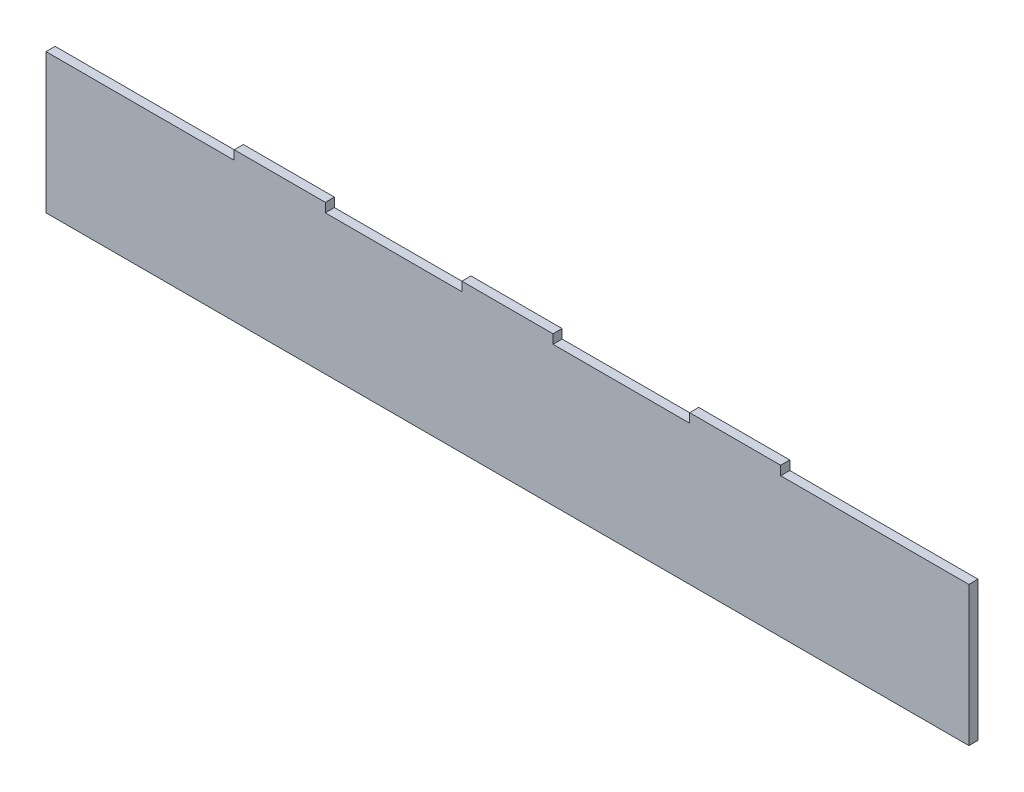
ISO-10303-21;
HEADER;
FILE_DESCRIPTION(('STEP AP214'),'2;1');
FILE_NAME('part.step','',(''),(''),'','','');
FILE_SCHEMA(('AUTOMOTIVE_DESIGN { 1 0 10303 214 1 1 1 1 }'));
ENDSEC;
DATA;
#1=APPLICATION_CONTEXT('core data for automotive mechanical design processes');
#2=APPLICATION_PROTOCOL_DEFINITION('international standard','automotive_design',2000,#1);
#3=PRODUCT_CONTEXT('',#1,'mechanical');
#4=PRODUCT('Part','Part','',(#3));
#5=PRODUCT_RELATED_PRODUCT_CATEGORY('part','',(#4));
#6=PRODUCT_DEFINITION_FORMATION('','',#4);
#7=PRODUCT_DEFINITION_CONTEXT('part definition',#1,'design');
#8=PRODUCT_DEFINITION('design','',#6,#7);
#9=PRODUCT_DEFINITION_SHAPE('','',#8);
#10=(LENGTH_UNIT() NAMED_UNIT(*) SI_UNIT(.MILLI.,.METRE.));
#11=(NAMED_UNIT(*) PLANE_ANGLE_UNIT() SI_UNIT($,.RADIAN.));
#12=(NAMED_UNIT(*) SI_UNIT($,.STERADIAN.) SOLID_ANGLE_UNIT());
#13=UNCERTAINTY_MEASURE_WITH_UNIT(LENGTH_MEASURE(1.E-05),#10,'distance_accuracy_value','');
#14=(GEOMETRIC_REPRESENTATION_CONTEXT(3) GLOBAL_UNCERTAINTY_ASSIGNED_CONTEXT((#13)) GLOBAL_UNIT_ASSIGNED_CONTEXT((#10,
#11,#12)) REPRESENTATION_CONTEXT('',''));
#15=CARTESIAN_POINT('',(0.,0.,0.));
#16=DIRECTION('',(0.,0.,1.));
#17=DIRECTION('',(1.,0.,0.));
#18=AXIS2_PLACEMENT_3D('',#15,#16,#17);
#19=CARTESIAN_POINT('',(-15.,0.,3.));
#20=DIRECTION('',(-1.,0.,0.));
#21=DIRECTION('',(0.,-1.,0.));
#22=AXIS2_PLACEMENT_3D('',#19,#20,#21);
#23=PLANE('',#22);
#24=DIRECTION('',(0.,1.,0.));
#25=VECTOR('',#24,1.);
#26=CARTESIAN_POINT('',(-15.,0.,0.));
#27=LINE('',#26,#25);
#28=CARTESIAN_POINT('',(-15.,23.0000000000001,0.));
#29=VERTEX_POINT('',#28);
#30=CARTESIAN_POINT('',(-15.,26.0000000000001,0.));
#31=VERTEX_POINT('',#30);
#32=EDGE_CURVE('E175',#29,#31,#27,.T.);
#33=ORIENTED_EDGE('',*,*,#32,.F.);
#34=DIRECTION('',(0.,0.,-1.));
#35=VECTOR('',#34,1.);
#36=CARTESIAN_POINT('',(-15.,23.0000000000001,3.));
#37=LINE('',#36,#35);
#38=CARTESIAN_POINT('',(-15.,23.0000000000001,3.));
#39=VERTEX_POINT('',#38);
#40=EDGE_CURVE('E11',#39,#29,#37,.T.);
#41=ORIENTED_EDGE('',*,*,#40,.F.);
#42=DIRECTION('',(0.,1.,0.));
#43=VECTOR('',#42,1.);
#44=CARTESIAN_POINT('',(-15.,0.,3.));
#45=LINE('',#44,#43);
#46=CARTESIAN_POINT('',(-15.,26.0000000000001,3.));
#47=VERTEX_POINT('',#46);
#48=EDGE_CURVE('E213',#39,#47,#45,.T.);
#49=ORIENTED_EDGE('',*,*,#48,.T.);
#50=DIRECTION('',(0.,0.,-1.));
#51=VECTOR('',#50,1.);
#52=CARTESIAN_POINT('',(-15.,26.0000000000001,3.));
#53=LINE('',#52,#51);
#54=EDGE_CURVE('E110',#47,#31,#53,.T.);
#55=ORIENTED_EDGE('',*,*,#54,.T.);
#56=EDGE_LOOP('',(#33,#41,#49,#55));
#57=FACE_BOUND('',#56,.T.);
#58=ADVANCED_FACE('F35',(#57),#23,.T.);
#59=CARTESIAN_POINT('',(0.,23.0000000000001,3.));
#60=DIRECTION('',(0.,-1.,0.));
#61=DIRECTION('',(1.,0.,0.));
#62=AXIS2_PLACEMENT_3D('',#59,#60,#61);
#63=PLANE('',#62);
#64=DIRECTION('',(-1.,0.,0.));
#65=VECTOR('',#64,1.);
#66=CARTESIAN_POINT('',(0.,23.0000000000001,0.));
#67=LINE('',#66,#65);
#68=CARTESIAN_POINT('',(-60.,23.0000000000001,0.));
#69=VERTEX_POINT('',#68);
#70=EDGE_CURVE('E178',#29,#69,#67,.T.);
#71=ORIENTED_EDGE('',*,*,#70,.T.);
#72=DIRECTION('',(0.,0.,-1.));
#73=VECTOR('',#72,1.);
#74=CARTESIAN_POINT('',(-60.,23.0000000000001,3.));
#75=LINE('',#74,#73);
#76=CARTESIAN_POINT('',(-60.,23.0000000000001,3.));
#77=VERTEX_POINT('',#76);
#78=EDGE_CURVE('E43',#77,#69,#75,.T.);
#79=ORIENTED_EDGE('',*,*,#78,.F.);
#80=DIRECTION('',(-1.,0.,0.));
#81=VECTOR('',#80,1.);
#82=CARTESIAN_POINT('',(0.,23.0000000000001,3.));
#83=LINE('',#82,#81);
#84=EDGE_CURVE('E266',#39,#77,#83,.T.);
#85=ORIENTED_EDGE('',*,*,#84,.F.);
#86=ORIENTED_EDGE('',*,*,#40,.T.);
#87=EDGE_LOOP('',(#71,#79,#85,#86));
#88=FACE_BOUND('',#87,.T.);
#89=ADVANCED_FACE('F293',(#88),#63,.F.);
#90=CARTESIAN_POINT('',(-60.,0.,3.));
#91=DIRECTION('',(-1.,0.,0.));
#92=DIRECTION('',(0.,0.,1.));
#93=AXIS2_PLACEMENT_3D('',#90,#91,#92);
#94=PLANE('',#93);
#95=DIRECTION('',(0.,1.,0.));
#96=VECTOR('',#95,1.);
#97=CARTESIAN_POINT('',(-60.,0.,0.));
#98=LINE('',#97,#96);
#99=CARTESIAN_POINT('',(-60.,26.0000000000001,0.));
#100=VERTEX_POINT('',#99);
#101=EDGE_CURVE('E180',#69,#100,#98,.T.);
#102=ORIENTED_EDGE('',*,*,#101,.T.);
#103=DIRECTION('',(0.,0.,-1.));
#104=VECTOR('',#103,1.);
#105=CARTESIAN_POINT('',(-60.,26.0000000000001,3.));
#106=LINE('',#105,#104);
#107=CARTESIAN_POINT('',(-60.,26.0000000000001,3.));
#108=VERTEX_POINT('',#107);
#109=EDGE_CURVE('E238',#108,#100,#106,.T.);
#110=ORIENTED_EDGE('',*,*,#109,.F.);
#111=DIRECTION('',(0.,1.,0.));
#112=VECTOR('',#111,1.);
#113=CARTESIAN_POINT('',(-60.,0.,3.));
#114=LINE('',#113,#112);
#115=EDGE_CURVE('E247',#77,#108,#114,.T.);
#116=ORIENTED_EDGE('',*,*,#115,.F.);
#117=ORIENTED_EDGE('',*,*,#78,.T.);
#118=EDGE_LOOP('',(#102,#110,#116,#117));
#119=FACE_BOUND('',#118,.T.);
#120=ADVANCED_FACE('F245',(#119),#94,.F.);
#121=CARTESIAN_POINT('',(0.,26.0000000000001,3.));
#122=DIRECTION('',(0.,-1.,0.));
#123=DIRECTION('',(1.,0.,0.));
#124=AXIS2_PLACEMENT_3D('',#121,#122,#123);
#125=PLANE('',#124);
#126=DIRECTION('',(-1.,0.,0.));
#127=VECTOR('',#126,1.);
#128=CARTESIAN_POINT('',(0.,26.0000000000001,0.));
#129=LINE('',#128,#127);
#130=CARTESIAN_POINT('',(-90.,26.,0.));
#131=VERTEX_POINT('',#130);
#132=EDGE_CURVE('E182',#100,#131,#129,.T.);
#133=ORIENTED_EDGE('',*,*,#132,.T.);
#134=DIRECTION('',(0.,0.,-1.));
#135=VECTOR('',#134,1.);
#136=CARTESIAN_POINT('',(-90.,26.,3.));
#137=LINE('',#136,#135);
#138=CARTESIAN_POINT('',(-90.,26.,3.));
#139=VERTEX_POINT('',#138);
#140=EDGE_CURVE('E236',#139,#131,#137,.T.);
#141=ORIENTED_EDGE('',*,*,#140,.F.);
#142=DIRECTION('',(-1.,0.,0.));
#143=VECTOR('',#142,1.);
#144=CARTESIAN_POINT('',(0.,26.0000000000001,3.));
#145=LINE('',#144,#143);
#146=EDGE_CURVE('E260',#108,#139,#145,.T.);
#147=ORIENTED_EDGE('',*,*,#146,.F.);
#148=ORIENTED_EDGE('',*,*,#109,.T.);
#149=EDGE_LOOP('',(#133,#141,#147,#148));
#150=FACE_BOUND('',#149,.T.);
#151=ADVANCED_FACE('F257',(#150),#125,.F.);
#152=CARTESIAN_POINT('',(-90.,0.,3.));
#153=DIRECTION('',(-1.,0.,0.));
#154=DIRECTION('',(0.,0.,1.));
#155=AXIS2_PLACEMENT_3D('',#152,#153,#154);
#156=PLANE('',#155);
#157=DIRECTION('',(0.,1.,0.));
#158=VECTOR('',#157,1.);
#159=CARTESIAN_POINT('',(-90.,0.,0.));
#160=LINE('',#159,#158);
#161=CARTESIAN_POINT('',(-90.,23.,0.));
#162=VERTEX_POINT('',#161);
#163=EDGE_CURVE('E185',#162,#131,#160,.T.);
#164=ORIENTED_EDGE('',*,*,#163,.F.);
#165=DIRECTION('',(0.,0.,-1.));
#166=VECTOR('',#165,1.);
#167=CARTESIAN_POINT('',(-90.,23.,3.));
#168=LINE('',#167,#166);
#169=CARTESIAN_POINT('',(-90.,23.,3.));
#170=VERTEX_POINT('',#169);
#171=EDGE_CURVE('E234',#170,#162,#168,.T.);
#172=ORIENTED_EDGE('',*,*,#171,.F.);
#173=DIRECTION('',(0.,1.,0.));
#174=VECTOR('',#173,1.);
#175=CARTESIAN_POINT('',(-90.,0.,3.));
#176=LINE('',#175,#174);
#177=EDGE_CURVE('E262',#170,#139,#176,.T.);
#178=ORIENTED_EDGE('',*,*,#177,.T.);
#179=ORIENTED_EDGE('',*,*,#140,.T.);
#180=EDGE_LOOP('',(#164,#172,#178,#179));
#181=FACE_BOUND('',#180,.T.);
#182=ADVANCED_FACE('F303',(#181),#156,.T.);
#183=CARTESIAN_POINT('',(0.,23.0000000000002,3.));
#184=DIRECTION('',(0.,-1.,0.));
#185=DIRECTION('',(1.,0.,0.));
#186=AXIS2_PLACEMENT_3D('',#183,#184,#185);
#187=PLANE('',#186);
#188=DIRECTION('',(-1.,0.,0.));
#189=VECTOR('',#188,1.);
#190=CARTESIAN_POINT('',(0.,23.0000000000002,0.));
#191=LINE('',#190,#189);
#192=CARTESIAN_POINT('',(-152.,22.9999999999999,0.));
#193=VERTEX_POINT('',#192);
#194=EDGE_CURVE('E188',#162,#193,#191,.T.);
#195=ORIENTED_EDGE('',*,*,#194,.T.);
#196=DIRECTION('',(0.,0.,-1.));
#197=VECTOR('',#196,1.);
#198=CARTESIAN_POINT('',(-152.,22.9999999999999,3.));
#199=LINE('',#198,#197);
#200=CARTESIAN_POINT('',(-152.,22.9999999999999,3.));
#201=VERTEX_POINT('',#200);
#202=EDGE_CURVE('E232',#201,#193,#199,.T.);
#203=ORIENTED_EDGE('',*,*,#202,.F.);
#204=DIRECTION('',(-1.,0.,0.));
#205=VECTOR('',#204,1.);
#206=CARTESIAN_POINT('',(0.,23.0000000000002,3.));
#207=LINE('',#206,#205);
#208=EDGE_CURVE('E264',#170,#201,#207,.T.);
#209=ORIENTED_EDGE('',*,*,#208,.F.);
#210=ORIENTED_EDGE('',*,*,#171,.T.);
#211=EDGE_LOOP('',(#195,#203,#209,#210));
#212=FACE_BOUND('',#211,.T.);
#213=ADVANCED_FACE('F306',(#212),#187,.F.);
#214=CARTESIAN_POINT('',(-152.,0.,3.));
#215=DIRECTION('',(-1.,0.,0.));
#216=DIRECTION('',(0.,0.,1.));
#217=AXIS2_PLACEMENT_3D('',#214,#215,#216);
#218=PLANE('',#217);
#219=DIRECTION('',(0.,1.,0.));
#220=VECTOR('',#219,1.);
#221=CARTESIAN_POINT('',(-152.,0.,0.));
#222=LINE('',#221,#220);
#223=CARTESIAN_POINT('',(-152.,-23.0000000000001,0.));
#224=VERTEX_POINT('',#223);
#225=EDGE_CURVE('E191',#224,#193,#222,.T.);
#226=ORIENTED_EDGE('',*,*,#225,.F.);
#227=DIRECTION('',(0.,0.,-1.));
#228=VECTOR('',#227,1.);
#229=CARTESIAN_POINT('',(-152.,-23.0000000000001,3.));
#230=LINE('',#229,#228);
#231=CARTESIAN_POINT('',(-152.,-23.0000000000001,3.));
#232=VERTEX_POINT('',#231);
#233=EDGE_CURVE('E230',#232,#224,#230,.T.);
#234=ORIENTED_EDGE('',*,*,#233,.F.);
#235=DIRECTION('',(0.,1.,0.));
#236=VECTOR('',#235,1.);
#237=CARTESIAN_POINT('',(-152.,0.,3.));
#238=LINE('',#237,#236);
#239=EDGE_CURVE('E271',#232,#201,#238,.T.);
#240=ORIENTED_EDGE('',*,*,#239,.T.);
#241=ORIENTED_EDGE('',*,*,#202,.T.);
#242=EDGE_LOOP('',(#226,#234,#240,#241));
#243=FACE_BOUND('',#242,.T.);
#244=ADVANCED_FACE('F310',(#243),#218,.T.);
#245=CARTESIAN_POINT('',(0.,-23.,3.));
#246=DIRECTION('',(0.,-1.,0.));
#247=DIRECTION('',(1.,0.,0.));
#248=AXIS2_PLACEMENT_3D('',#245,#246,#247);
#249=PLANE('',#248);
#250=DIRECTION('',(-1.,0.,0.));
#251=VECTOR('',#250,1.);
#252=CARTESIAN_POINT('',(0.,-23.,0.));
#253=LINE('',#252,#251);
#254=CARTESIAN_POINT('',(152.,-22.9999999999999,0.));
#255=VERTEX_POINT('',#254);
#256=EDGE_CURVE('E194',#255,#224,#253,.T.);
#257=ORIENTED_EDGE('',*,*,#256,.F.);
#258=DIRECTION('',(0.,0.,-1.));
#259=VECTOR('',#258,1.);
#260=CARTESIAN_POINT('',(152.,-22.9999999999999,3.));
#261=LINE('',#260,#259);
#262=CARTESIAN_POINT('',(152.,-22.9999999999999,3.));
#263=VERTEX_POINT('',#262);
#264=EDGE_CURVE('E228',#263,#255,#261,.T.);
#265=ORIENTED_EDGE('',*,*,#264,.F.);
#266=DIRECTION('',(-1.,0.,0.));
#267=VECTOR('',#266,1.);
#268=CARTESIAN_POINT('',(0.,-23.,3.));
#269=LINE('',#268,#267);
#270=EDGE_CURVE('E274',#263,#232,#269,.T.);
#271=ORIENTED_EDGE('',*,*,#270,.T.);
#272=ORIENTED_EDGE('',*,*,#233,.T.);
#273=EDGE_LOOP('',(#257,#265,#271,#272));
#274=FACE_BOUND('',#273,.T.);
#275=ADVANCED_FACE('F314',(#274),#249,.T.);
#276=CARTESIAN_POINT('',(152.,0.,3.));
#277=DIRECTION('',(-1.,0.,0.));
#278=DIRECTION('',(0.,0.,1.));
#279=AXIS2_PLACEMENT_3D('',#276,#277,#278);
#280=PLANE('',#279);
#281=DIRECTION('',(0.,1.,0.));
#282=VECTOR('',#281,1.);
#283=CARTESIAN_POINT('',(152.,0.,0.));
#284=LINE('',#283,#282);
#285=CARTESIAN_POINT('',(152.,23.,0.));
#286=VERTEX_POINT('',#285);
#287=EDGE_CURVE('E197',#255,#286,#284,.T.);
#288=ORIENTED_EDGE('',*,*,#287,.T.);
#289=DIRECTION('',(0.,0.,-1.));
#290=VECTOR('',#289,1.);
#291=CARTESIAN_POINT('',(152.,23.,3.));
#292=LINE('',#291,#290);
#293=CARTESIAN_POINT('',(152.,23.,3.));
#294=VERTEX_POINT('',#293);
#295=EDGE_CURVE('E225',#294,#286,#292,.T.);
#296=ORIENTED_EDGE('',*,*,#295,.F.);
#297=DIRECTION('',(0.,1.,0.));
#298=VECTOR('',#297,1.);
#299=CARTESIAN_POINT('',(152.,0.,3.));
#300=LINE('',#299,#298);
#301=EDGE_CURVE('E277',#263,#294,#300,.T.);
#302=ORIENTED_EDGE('',*,*,#301,.F.);
#303=ORIENTED_EDGE('',*,*,#264,.T.);
#304=EDGE_LOOP('',(#288,#296,#302,#303));
#305=FACE_BOUND('',#304,.T.);
#306=ADVANCED_FACE('F318',(#305),#280,.F.);
#307=CARTESIAN_POINT('',(0.,23.0000000000002,3.));
#308=DIRECTION('',(0.,-1.,0.));
#309=DIRECTION('',(1.,0.,0.));
#310=AXIS2_PLACEMENT_3D('',#307,#308,#309);
#311=PLANE('',#310);
#312=DIRECTION('',(-1.,0.,0.));
#313=VECTOR('',#312,1.);
#314=CARTESIAN_POINT('',(0.,23.0000000000002,0.));
#315=LINE('',#314,#313);
#316=CARTESIAN_POINT('',(90.,23.0000000000001,0.));
#317=VERTEX_POINT('',#316);
#318=EDGE_CURVE('E199',#286,#317,#315,.T.);
#319=ORIENTED_EDGE('',*,*,#318,.T.);
#320=DIRECTION('',(0.,0.,-1.));
#321=VECTOR('',#320,1.);
#322=CARTESIAN_POINT('',(90.,23.0000000000001,3.));
#323=LINE('',#322,#321);
#324=CARTESIAN_POINT('',(90.,23.0000000000001,3.));
#325=VERTEX_POINT('',#324);
#326=EDGE_CURVE('E222',#325,#317,#323,.T.);
#327=ORIENTED_EDGE('',*,*,#326,.F.);
#328=DIRECTION('',(-1.,0.,0.));
#329=VECTOR('',#328,1.);
#330=CARTESIAN_POINT('',(0.,23.0000000000002,3.));
#331=LINE('',#330,#329);
#332=EDGE_CURVE('E279',#294,#325,#331,.T.);
#333=ORIENTED_EDGE('',*,*,#332,.F.);
#334=ORIENTED_EDGE('',*,*,#295,.T.);
#335=EDGE_LOOP('',(#319,#327,#333,#334));
#336=FACE_BOUND('',#335,.T.);
#337=ADVANCED_FACE('F322',(#336),#311,.F.);
#338=CARTESIAN_POINT('',(90.,0.,3.));
#339=DIRECTION('',(-1.,0.,0.));
#340=DIRECTION('',(0.,0.,1.));
#341=AXIS2_PLACEMENT_3D('',#338,#339,#340);
#342=PLANE('',#341);
#343=DIRECTION('',(0.,1.,0.));
#344=VECTOR('',#343,1.);
#345=CARTESIAN_POINT('',(90.,0.,0.));
#346=LINE('',#345,#344);
#347=CARTESIAN_POINT('',(90.,26.0000000000001,0.));
#348=VERTEX_POINT('',#347);
#349=EDGE_CURVE('E201',#317,#348,#346,.T.);
#350=ORIENTED_EDGE('',*,*,#349,.T.);
#351=DIRECTION('',(0.,0.,-1.));
#352=VECTOR('',#351,1.);
#353=CARTESIAN_POINT('',(90.,26.0000000000001,3.));
#354=LINE('',#353,#352);
#355=CARTESIAN_POINT('',(90.,26.0000000000001,3.));
#356=VERTEX_POINT('',#355);
#357=EDGE_CURVE('E219',#356,#348,#354,.T.);
#358=ORIENTED_EDGE('',*,*,#357,.F.);
#359=DIRECTION('',(0.,1.,0.));
#360=VECTOR('',#359,1.);
#361=CARTESIAN_POINT('',(90.,0.,3.));
#362=LINE('',#361,#360);
#363=EDGE_CURVE('E281',#325,#356,#362,.T.);
#364=ORIENTED_EDGE('',*,*,#363,.F.);
#365=ORIENTED_EDGE('',*,*,#326,.T.);
#366=EDGE_LOOP('',(#350,#358,#364,#365));
#367=FACE_BOUND('',#366,.T.);
#368=ADVANCED_FACE('F326',(#367),#342,.F.);
#369=CARTESIAN_POINT('',(0.,26.,3.));
#370=DIRECTION('',(0.,-1.,0.));
#371=DIRECTION('',(1.,0.,0.));
#372=AXIS2_PLACEMENT_3D('',#369,#370,#371);
#373=PLANE('',#372);
#374=DIRECTION('',(-1.,0.,0.));
#375=VECTOR('',#374,1.);
#376=CARTESIAN_POINT('',(0.,26.,0.));
#377=LINE('',#376,#375);
#378=CARTESIAN_POINT('',(60.,26.0000000000001,0.));
#379=VERTEX_POINT('',#378);
#380=EDGE_CURVE('E203',#348,#379,#377,.T.);
#381=ORIENTED_EDGE('',*,*,#380,.T.);
#382=DIRECTION('',(0.,0.,-1.));
#383=VECTOR('',#382,1.);
#384=CARTESIAN_POINT('',(60.,26.0000000000001,3.));
#385=LINE('',#384,#383);
#386=CARTESIAN_POINT('',(60.,26.0000000000001,3.));
#387=VERTEX_POINT('',#386);
#388=EDGE_CURVE('E217',#387,#379,#385,.T.);
#389=ORIENTED_EDGE('',*,*,#388,.F.);
#390=DIRECTION('',(-1.,0.,0.));
#391=VECTOR('',#390,1.);
#392=CARTESIAN_POINT('',(0.,26.,3.));
#393=LINE('',#392,#391);
#394=EDGE_CURVE('E283',#356,#387,#393,.T.);
#395=ORIENTED_EDGE('',*,*,#394,.F.);
#396=ORIENTED_EDGE('',*,*,#357,.T.);
#397=EDGE_LOOP('',(#381,#389,#395,#396));
#398=FACE_BOUND('',#397,.T.);
#399=ADVANCED_FACE('F330',(#398),#373,.F.);
#400=CARTESIAN_POINT('',(60.,-1.38777878078144E-13,3.));
#401=DIRECTION('',(-1.,0.,0.));
#402=DIRECTION('',(0.,-1.,0.));
#403=AXIS2_PLACEMENT_3D('',#400,#401,#402);
#404=PLANE('',#403);
#405=DIRECTION('',(0.,1.,0.));
#406=VECTOR('',#405,1.);
#407=CARTESIAN_POINT('',(60.,-1.38777878078144E-13,0.));
#408=LINE('',#407,#406);
#409=CARTESIAN_POINT('',(60.,23.0000000000001,0.));
#410=VERTEX_POINT('',#409);
#411=EDGE_CURVE('E206',#410,#379,#408,.T.);
#412=ORIENTED_EDGE('',*,*,#411,.F.);
#413=DIRECTION('',(0.,0.,-1.));
#414=VECTOR('',#413,1.);
#415=CARTESIAN_POINT('',(60.,23.0000000000001,3.));
#416=LINE('',#415,#414);
#417=CARTESIAN_POINT('',(60.,23.0000000000001,3.));
#418=VERTEX_POINT('',#417);
#419=EDGE_CURVE('E167',#418,#410,#416,.T.);
#420=ORIENTED_EDGE('',*,*,#419,.F.);
#421=DIRECTION('',(0.,1.,0.));
#422=VECTOR('',#421,1.);
#423=CARTESIAN_POINT('',(60.,-1.38777878078144E-13,3.));
#424=LINE('',#423,#422);
#425=EDGE_CURVE('E160',#418,#387,#424,.T.);
#426=ORIENTED_EDGE('',*,*,#425,.T.);
#427=ORIENTED_EDGE('',*,*,#388,.T.);
#428=EDGE_LOOP('',(#412,#420,#426,#427));
#429=FACE_BOUND('',#428,.T.);
#430=ADVANCED_FACE('F286',(#429),#404,.T.);
#431=CARTESIAN_POINT('',(0.,23.0000000000001,3.));
#432=DIRECTION('',(0.,-1.,0.));
#433=DIRECTION('',(1.,0.,0.));
#434=AXIS2_PLACEMENT_3D('',#431,#432,#433);
#435=PLANE('',#434);
#436=DIRECTION('',(-1.,0.,0.));
#437=VECTOR('',#436,1.);
#438=CARTESIAN_POINT('',(0.,23.0000000000001,0.));
#439=LINE('',#438,#437);
#440=CARTESIAN_POINT('',(15.,23.0000000000001,0.));
#441=VERTEX_POINT('',#440);
#442=EDGE_CURVE('E166',#410,#441,#439,.T.);
#443=ORIENTED_EDGE('',*,*,#442,.T.);
#444=DIRECTION('',(0.,0.,-1.));
#445=VECTOR('',#444,1.);
#446=CARTESIAN_POINT('',(15.,23.0000000000001,3.));
#447=LINE('',#446,#445);
#448=CARTESIAN_POINT('',(15.,23.0000000000001,3.));
#449=VERTEX_POINT('',#448);
#450=EDGE_CURVE('E163',#449,#441,#447,.T.);
#451=ORIENTED_EDGE('',*,*,#450,.F.);
#452=DIRECTION('',(-1.,0.,0.));
#453=VECTOR('',#452,1.);
#454=CARTESIAN_POINT('',(0.,23.0000000000001,3.));
#455=LINE('',#454,#453);
#456=EDGE_CURVE('E154',#418,#449,#455,.T.);
#457=ORIENTED_EDGE('',*,*,#456,.F.);
#458=ORIENTED_EDGE('',*,*,#419,.T.);
#459=EDGE_LOOP('',(#443,#451,#457,#458));
#460=FACE_BOUND('',#459,.T.);
#461=ADVANCED_FACE('F164',(#460),#435,.F.);
#462=CARTESIAN_POINT('',(15.,0.,3.));
#463=DIRECTION('',(-1.,0.,0.));
#464=DIRECTION('',(0.,-1.,0.));
#465=AXIS2_PLACEMENT_3D('',#462,#463,#464);
#466=PLANE('',#465);
#467=DIRECTION('',(0.,1.,0.));
#468=VECTOR('',#467,1.);
#469=CARTESIAN_POINT('',(15.,0.,0.));
#470=LINE('',#469,#468);
#471=CARTESIAN_POINT('',(15.,26.0000000000001,0.));
#472=VERTEX_POINT('',#471);
#473=EDGE_CURVE('E103',#441,#472,#470,.T.);
#474=ORIENTED_EDGE('',*,*,#473,.T.);
#475=DIRECTION('',(0.,0.,-1.));
#476=VECTOR('',#475,1.);
#477=CARTESIAN_POINT('',(15.,26.0000000000001,3.));
#478=LINE('',#477,#476);
#479=CARTESIAN_POINT('',(15.,26.0000000000001,3.));
#480=VERTEX_POINT('',#479);
#481=EDGE_CURVE('E168',#480,#472,#478,.T.);
#482=ORIENTED_EDGE('',*,*,#481,.F.);
#483=DIRECTION('',(0.,1.,0.));
#484=VECTOR('',#483,1.);
#485=CARTESIAN_POINT('',(15.,0.,3.));
#486=LINE('',#485,#484);
#487=EDGE_CURVE('E158',#449,#480,#486,.T.);
#488=ORIENTED_EDGE('',*,*,#487,.F.);
#489=ORIENTED_EDGE('',*,*,#450,.T.);
#490=EDGE_LOOP('',(#474,#482,#488,#489));
#491=FACE_BOUND('',#490,.T.);
#492=ADVANCED_FACE('F170',(#491),#466,.F.);
#493=CARTESIAN_POINT('',(0.,26.0000000000001,3.));
#494=DIRECTION('',(0.,-1.,0.));
#495=DIRECTION('',(1.,0.,0.));
#496=AXIS2_PLACEMENT_3D('',#493,#494,#495);
#497=PLANE('',#496);
#498=DIRECTION('',(-1.,0.,0.));
#499=VECTOR('',#498,1.);
#500=CARTESIAN_POINT('',(0.,26.0000000000001,0.));
#501=LINE('',#500,#499);
#502=EDGE_CURVE('E211',#472,#31,#501,.T.);
#503=ORIENTED_EDGE('',*,*,#502,.T.);
#504=ORIENTED_EDGE('',*,*,#54,.F.);
#505=DIRECTION('',(-1.,0.,0.));
#506=VECTOR('',#505,1.);
#507=CARTESIAN_POINT('',(0.,26.0000000000001,3.));
#508=LINE('',#507,#506);
#509=EDGE_CURVE('E51',#480,#47,#508,.T.);
#510=ORIENTED_EDGE('',*,*,#509,.F.);
#511=ORIENTED_EDGE('',*,*,#481,.T.);
#512=EDGE_LOOP('',(#503,#504,#510,#511));
#513=FACE_BOUND('',#512,.T.);
#514=ADVANCED_FACE('F291',(#513),#497,.F.);
#515=CARTESIAN_POINT('',(0.,0.,3.));
#516=DIRECTION('',(0.,0.,1.));
#517=DIRECTION('',(1.,0.,0.));
#518=AXIS2_PLACEMENT_3D('',#515,#516,#517);
#519=PLANE('',#518);
#520=ORIENTED_EDGE('',*,*,#48,.F.);
#521=ORIENTED_EDGE('',*,*,#84,.T.);
#522=ORIENTED_EDGE('',*,*,#115,.T.);
#523=ORIENTED_EDGE('',*,*,#146,.T.);
#524=ORIENTED_EDGE('',*,*,#177,.F.);
#525=ORIENTED_EDGE('',*,*,#208,.T.);
#526=ORIENTED_EDGE('',*,*,#239,.F.);
#527=ORIENTED_EDGE('',*,*,#270,.F.);
#528=ORIENTED_EDGE('',*,*,#301,.T.);
#529=ORIENTED_EDGE('',*,*,#332,.T.);
#530=ORIENTED_EDGE('',*,*,#363,.T.);
#531=ORIENTED_EDGE('',*,*,#394,.T.);
#532=ORIENTED_EDGE('',*,*,#425,.F.);
#533=ORIENTED_EDGE('',*,*,#456,.T.);
#534=ORIENTED_EDGE('',*,*,#487,.T.);
#535=ORIENTED_EDGE('',*,*,#509,.T.);
#536=EDGE_LOOP('',(#520,#521,#522,#523,#524,#525,#526,#527,#528,#529,#530,#531,#532,#533,#534,#535));
#537=FACE_BOUND('',#536,.T.);
#538=ADVANCED_FACE('F156',(#537),#519,.T.);
#539=CARTESIAN_POINT('',(0.,0.,0.));
#540=DIRECTION('',(0.,0.,1.));
#541=DIRECTION('',(1.,0.,0.));
#542=AXIS2_PLACEMENT_3D('',#539,#540,#541);
#543=PLANE('',#542);
#544=ORIENTED_EDGE('',*,*,#32,.T.);
#545=ORIENTED_EDGE('',*,*,#502,.F.);
#546=ORIENTED_EDGE('',*,*,#473,.F.);
#547=ORIENTED_EDGE('',*,*,#442,.F.);
#548=ORIENTED_EDGE('',*,*,#411,.T.);
#549=ORIENTED_EDGE('',*,*,#380,.F.);
#550=ORIENTED_EDGE('',*,*,#349,.F.);
#551=ORIENTED_EDGE('',*,*,#318,.F.);
#552=ORIENTED_EDGE('',*,*,#287,.F.);
#553=ORIENTED_EDGE('',*,*,#256,.T.);
#554=ORIENTED_EDGE('',*,*,#225,.T.);
#555=ORIENTED_EDGE('',*,*,#194,.F.);
#556=ORIENTED_EDGE('',*,*,#163,.T.);
#557=ORIENTED_EDGE('',*,*,#132,.F.);
#558=ORIENTED_EDGE('',*,*,#101,.F.);
#559=ORIENTED_EDGE('',*,*,#70,.F.);
#560=EDGE_LOOP('',(#544,#545,#546,#547,#548,#549,#550,#551,#552,#553,#554,#555,#556,#557,#558,#559));
#561=FACE_BOUND('',#560,.T.);
#562=ADVANCED_FACE('F252',(#561),#543,.F.);
#563=CLOSED_SHELL('',(#58,#89,#120,#151,#182,#213,#244,#275,#306,#337,#368,#399,#430,#461,#492,
#514,#538,#562));
#564=MANIFOLD_SOLID_BREP('B2',#563);
#565=ADVANCED_BREP_SHAPE_REPRESENTATION('',(#18,#564),#14);
#566=SHAPE_DEFINITION_REPRESENTATION(#9,#565);
ENDSEC;
END-ISO-10303-21;
